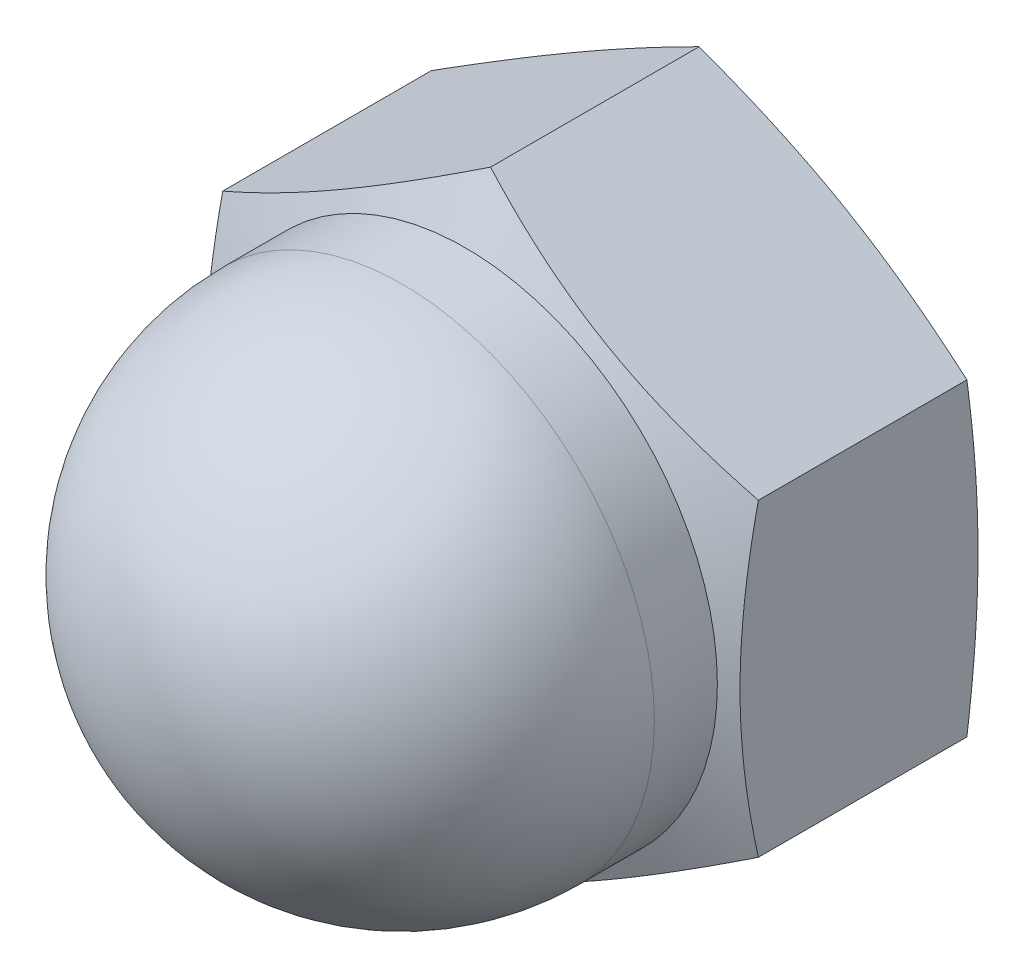
ISO-10303-21;
HEADER;
FILE_DESCRIPTION(('STEP AP214'),'2;1');
FILE_NAME('part.step','',(''),(''),'','','');
FILE_SCHEMA(('AUTOMOTIVE_DESIGN { 1 0 10303 214 1 1 1 1 }'));
ENDSEC;
DATA;
#1=APPLICATION_CONTEXT('core data for automotive mechanical design processes');
#2=APPLICATION_PROTOCOL_DEFINITION('international standard','automotive_design',2000,#1);
#3=PRODUCT_CONTEXT('',#1,'mechanical');
#4=PRODUCT('Part','Part','',(#3));
#5=PRODUCT_RELATED_PRODUCT_CATEGORY('part','',(#4));
#6=PRODUCT_DEFINITION_FORMATION('','',#4);
#7=PRODUCT_DEFINITION_CONTEXT('part definition',#1,'design');
#8=PRODUCT_DEFINITION('design','',#6,#7);
#9=PRODUCT_DEFINITION_SHAPE('','',#8);
#10=(LENGTH_UNIT() NAMED_UNIT(*) SI_UNIT(.MILLI.,.METRE.));
#11=(NAMED_UNIT(*) PLANE_ANGLE_UNIT() SI_UNIT($,.RADIAN.));
#12=(NAMED_UNIT(*) SI_UNIT($,.STERADIAN.) SOLID_ANGLE_UNIT());
#13=UNCERTAINTY_MEASURE_WITH_UNIT(LENGTH_MEASURE(1.E-05),#10,'distance_accuracy_value','');
#14=(GEOMETRIC_REPRESENTATION_CONTEXT(3) GLOBAL_UNCERTAINTY_ASSIGNED_CONTEXT((#13)) GLOBAL_UNIT_ASSIGNED_CONTEXT((#10,
#11,#12)) REPRESENTATION_CONTEXT('',''));
#15=CARTESIAN_POINT('',(0.,0.,0.));
#16=DIRECTION('',(0.,0.,1.));
#17=DIRECTION('',(1.,0.,0.));
#18=AXIS2_PLACEMENT_3D('',#15,#16,#17);
#19=CARTESIAN_POINT('',(4.25,-7.36121593216773,0.));
#20=DIRECTION('',(0.5,-0.866025403784439,0.));
#21=DIRECTION('',(0.866025403784439,0.5,0.));
#22=AXIS2_PLACEMENT_3D('',#19,#20,#21);
#23=PLANE('',#22);
#24=CARTESIAN_POINT('',(0.,-9.81495457622364,7.2));
#25=CARTESIAN_POINT('',(4.25,-7.36121593216771,8.28156476253477));
#26=CARTESIAN_POINT('',(8.5,-4.90747728811183,7.2));
#27=(BOUNDED_CURVE() B_SPLINE_CURVE(2,(#24,#25,#26),.UNSPECIFIED.,.F.,
.F.) B_SPLINE_CURVE_WITH_KNOTS((3,3),(0.,9.88317351972094),
.UNSPECIFIED.) CURVE() GEOMETRIC_REPRESENTATION_ITEM() RATIONAL_B_SPLINE_CURVE((1.,
1.15470053837925,1.)) REPRESENTATION_ITEM(''));
#28=CARTESIAN_POINT('',(0.,-9.81495457622364,7.2));
#29=VERTEX_POINT('',#28);
#30=CARTESIAN_POINT('',(8.5,-4.90747728811183,7.2));
#31=VERTEX_POINT('',#30);
#32=EDGE_CURVE('E100',#29,#31,#27,.T.);
#33=ORIENTED_EDGE('',*,*,#32,.F.);
#34=DIRECTION('',(0.,0.,1.));
#35=VECTOR('',#34,1.);
#36=CARTESIAN_POINT('',(0.,-9.81495457622364,0.));
#37=LINE('',#36,#35);
#38=CARTESIAN_POINT('',(0.,-9.81495457622364,0.580097830349188));
#39=VERTEX_POINT('',#38);
#40=EDGE_CURVE('E85',#39,#29,#37,.T.);
#41=ORIENTED_EDGE('',*,*,#40,.F.);
#42=CARTESIAN_POINT('',(8.5,-4.90747728811183,0.580097830349187));
#43=CARTESIAN_POINT('',(4.25,-7.36121593216773,-0.0773794577626313));
#44=CARTESIAN_POINT('',(0.,-9.81495457622364,0.580097830349188));
#45=(BOUNDED_CURVE() B_SPLINE_CURVE(2,(#42,#43,#44),.UNSPECIFIED.,.F.,
.F.) B_SPLINE_CURVE_WITH_KNOTS((3,3),(0.,9.84021900679874),
.UNSPECIFIED.) CURVE() GEOMETRIC_REPRESENTATION_ITEM() RATIONAL_B_SPLINE_CURVE((1.,
1.15470053837925,1.)) REPRESENTATION_ITEM(''));
#46=CARTESIAN_POINT('',(8.5,-4.90747728811183,0.580097830349188));
#47=VERTEX_POINT('',#46);
#48=EDGE_CURVE('E131',#47,#39,#45,.T.);
#49=ORIENTED_EDGE('',*,*,#48,.F.);
#50=DIRECTION('',(0.,0.,1.));
#51=VECTOR('',#50,1.);
#52=CARTESIAN_POINT('',(8.5,-4.90747728811183,0.));
#53=LINE('',#52,#51);
#54=EDGE_CURVE('E9',#47,#31,#53,.T.);
#55=ORIENTED_EDGE('',*,*,#54,.T.);
#56=EDGE_LOOP('',(#33,#41,#49,#55));
#57=FACE_BOUND('',#56,.T.);
#58=ADVANCED_FACE('F15',(#57),#23,.T.);
#59=CARTESIAN_POINT('',(8.5,0.,0.));
#60=DIRECTION('',(1.,0.,0.));
#61=DIRECTION('',(0.,1.,0.));
#62=AXIS2_PLACEMENT_3D('',#59,#60,#61);
#63=PLANE('',#62);
#64=CARTESIAN_POINT('',(8.5,-4.90747728811182,7.2));
#65=CARTESIAN_POINT('',(8.49999999999999,0.,8.28156476253477));
#66=CARTESIAN_POINT('',(8.5,4.90747728811182,7.2));
#67=(BOUNDED_CURVE() B_SPLINE_CURVE(2,(#64,#65,#66),.UNSPECIFIED.,.F.,
.F.) B_SPLINE_CURVE_WITH_KNOTS((3,3),(0.,9.88317351972096),
.UNSPECIFIED.) CURVE() GEOMETRIC_REPRESENTATION_ITEM() RATIONAL_B_SPLINE_CURVE((1.,
1.15470053837925,1.)) REPRESENTATION_ITEM(''));
#68=CARTESIAN_POINT('',(8.5,4.90747728811182,7.2));
#69=VERTEX_POINT('',#68);
#70=EDGE_CURVE('E105',#31,#69,#67,.T.);
#71=ORIENTED_EDGE('',*,*,#70,.F.);
#72=ORIENTED_EDGE('',*,*,#54,.F.);
#73=CARTESIAN_POINT('',(8.5,4.90747728811182,0.580097830349187));
#74=CARTESIAN_POINT('',(8.50000000000001,0.,-0.077379457762633));
#75=CARTESIAN_POINT('',(8.5,-4.90747728811183,0.580097830349188));
#76=(BOUNDED_CURVE() B_SPLINE_CURVE(2,(#73,#74,#75),.UNSPECIFIED.,.F.,
.F.) B_SPLINE_CURVE_WITH_KNOTS((3,3),(0.,9.84021900679875),
.UNSPECIFIED.) CURVE() GEOMETRIC_REPRESENTATION_ITEM() RATIONAL_B_SPLINE_CURVE((1.,
1.15470053837925,1.)) REPRESENTATION_ITEM(''));
#77=CARTESIAN_POINT('',(8.5,4.90747728811182,0.580097830349187));
#78=VERTEX_POINT('',#77);
#79=EDGE_CURVE('E19',#78,#47,#76,.T.);
#80=ORIENTED_EDGE('',*,*,#79,.F.);
#81=DIRECTION('',(0.,0.,1.));
#82=VECTOR('',#81,1.);
#83=CARTESIAN_POINT('',(8.5,4.90747728811182,0.));
#84=LINE('',#83,#82);
#85=EDGE_CURVE('E27',#78,#69,#84,.T.);
#86=ORIENTED_EDGE('',*,*,#85,.T.);
#87=EDGE_LOOP('',(#71,#72,#80,#86));
#88=FACE_BOUND('',#87,.T.);
#89=ADVANCED_FACE('F229',(#88),#63,.T.);
#90=CARTESIAN_POINT('',(0.,0.,0.));
#91=DIRECTION('',(0.,0.,1.));
#92=DIRECTION('',(1.,0.,0.));
#93=AXIS2_PLACEMENT_3D('',#90,#91,#92);
#94=PLANE('',#93);
#95=CARTESIAN_POINT('',(0.,0.,0.));
#96=DIRECTION('',(0.,0.,1.));
#97=DIRECTION('',(1.,0.,0.));
#98=AXIS2_PLACEMENT_3D('',#95,#96,#97);
#99=CIRCLE('',#98,7.65);
#100=CARTESIAN_POINT('',(7.65,0.,0.));
#101=VERTEX_POINT('',#100);
#102=EDGE_CURVE('E156',#101,#101,#99,.T.);
#103=ORIENTED_EDGE('',*,*,#102,.F.);
#104=EDGE_LOOP('',(#103));
#105=FACE_BOUND('',#104,.T.);
#106=CARTESIAN_POINT('',(0.,0.,0.));
#107=DIRECTION('',(0.,0.,1.));
#108=DIRECTION('',(1.,0.,0.));
#109=AXIS2_PLACEMENT_3D('',#106,#107,#108);
#110=CIRCLE('',#109,5.);
#111=CARTESIAN_POINT('',(5.,0.,0.));
#112=VERTEX_POINT('',#111);
#113=EDGE_CURVE('E126',#112,#112,#110,.T.);
#114=ORIENTED_EDGE('',*,*,#113,.T.);
#115=EDGE_LOOP('',(#114));
#116=FACE_BOUND('',#115,.T.);
#117=ADVANCED_FACE('F233',(#105,#116),#94,.F.);
#118=CARTESIAN_POINT('',(4.25,7.36121593216773,0.));
#119=DIRECTION('',(0.5,0.866025403784439,0.));
#120=DIRECTION('',(-0.866025403784439,0.5,0.));
#121=AXIS2_PLACEMENT_3D('',#118,#119,#120);
#122=PLANE('',#121);
#123=CARTESIAN_POINT('',(8.5,4.90747728811182,7.2));
#124=CARTESIAN_POINT('',(4.25,7.36121593216769,8.28156476253478));
#125=CARTESIAN_POINT('',(0.,9.81495457622363,7.2));
#126=(BOUNDED_CURVE() B_SPLINE_CURVE(2,(#123,#124,#125),.UNSPECIFIED.,.F.,
.F.) B_SPLINE_CURVE_WITH_KNOTS((3,3),(0.,9.88317351972094),
.UNSPECIFIED.) CURVE() GEOMETRIC_REPRESENTATION_ITEM() RATIONAL_B_SPLINE_CURVE((1.,
1.15470053837926,1.)) REPRESENTATION_ITEM(''));
#127=CARTESIAN_POINT('',(0.,9.81495457622364,7.2));
#128=VERTEX_POINT('',#127);
#129=EDGE_CURVE('E149',#69,#128,#126,.T.);
#130=ORIENTED_EDGE('',*,*,#129,.F.);
#131=ORIENTED_EDGE('',*,*,#85,.F.);
#132=CARTESIAN_POINT('',(0.,9.81495457622364,0.580097830349187));
#133=CARTESIAN_POINT('',(4.25,7.36121593216771,-0.0773794577626321));
#134=CARTESIAN_POINT('',(8.5,4.90747728811182,0.580097830349187));
#135=(BOUNDED_CURVE() B_SPLINE_CURVE(2,(#132,#133,#134),.UNSPECIFIED.,.F.,
.F.) B_SPLINE_CURVE_WITH_KNOTS((3,3),(0.,9.84021900679874),
.UNSPECIFIED.) CURVE() GEOMETRIC_REPRESENTATION_ITEM() RATIONAL_B_SPLINE_CURVE((1.,
1.15470053837925,1.)) REPRESENTATION_ITEM(''));
#136=CARTESIAN_POINT('',(0.,9.81495457622364,0.580097830349187));
#137=VERTEX_POINT('',#136);
#138=EDGE_CURVE('E137',#137,#78,#135,.T.);
#139=ORIENTED_EDGE('',*,*,#138,.F.);
#140=DIRECTION('',(0.,0.,1.));
#141=VECTOR('',#140,1.);
#142=CARTESIAN_POINT('',(0.,9.81495457622364,0.));
#143=LINE('',#142,#141);
#144=EDGE_CURVE('E136',#137,#128,#143,.T.);
#145=ORIENTED_EDGE('',*,*,#144,.T.);
#146=EDGE_LOOP('',(#130,#131,#139,#145));
#147=FACE_BOUND('',#146,.T.);
#148=ADVANCED_FACE('F243',(#147),#122,.T.);
#149=CARTESIAN_POINT('',(-4.25,7.36121593216773,0.));
#150=DIRECTION('',(-0.5,0.866025403784439,0.));
#151=DIRECTION('',(-0.866025403784439,-0.5,0.));
#152=AXIS2_PLACEMENT_3D('',#149,#150,#151);
#153=PLANE('',#152);
#154=CARTESIAN_POINT('',(0.,9.81495457622364,7.2));
#155=CARTESIAN_POINT('',(-4.25,7.36121593216774,8.28156476253478));
#156=CARTESIAN_POINT('',(-8.5,4.90747728811182,7.2));
#157=(BOUNDED_CURVE() B_SPLINE_CURVE(2,(#154,#155,#156),.UNSPECIFIED.,.F.,
.F.) B_SPLINE_CURVE_WITH_KNOTS((3,3),(0.,9.88317351972095),
.UNSPECIFIED.) CURVE() GEOMETRIC_REPRESENTATION_ITEM() RATIONAL_B_SPLINE_CURVE((1.,
1.15470053837925,1.)) REPRESENTATION_ITEM(''));
#158=CARTESIAN_POINT('',(-8.5,4.90747728811182,7.2));
#159=VERTEX_POINT('',#158);
#160=EDGE_CURVE('E113',#128,#159,#157,.T.);
#161=ORIENTED_EDGE('',*,*,#160,.F.);
#162=ORIENTED_EDGE('',*,*,#144,.F.);
#163=CARTESIAN_POINT('',(-8.5,4.90747728811182,0.580097830349187));
#164=CARTESIAN_POINT('',(-4.25,7.36121593216771,-0.0773794577626321));
#165=CARTESIAN_POINT('',(0.,9.81495457622364,0.580097830349187));
#166=(BOUNDED_CURVE() B_SPLINE_CURVE(2,(#163,#164,#165),.UNSPECIFIED.,.F.,
.F.) B_SPLINE_CURVE_WITH_KNOTS((3,3),(0.,9.84021900679874),
.UNSPECIFIED.) CURVE() GEOMETRIC_REPRESENTATION_ITEM() RATIONAL_B_SPLINE_CURVE((1.,
1.15470053837925,1.)) REPRESENTATION_ITEM(''));
#167=CARTESIAN_POINT('',(-8.5,4.90747728811182,0.580097830349187));
#168=VERTEX_POINT('',#167);
#169=EDGE_CURVE('E160',#168,#137,#166,.T.);
#170=ORIENTED_EDGE('',*,*,#169,.F.);
#171=DIRECTION('',(0.,0.,1.));
#172=VECTOR('',#171,1.);
#173=CARTESIAN_POINT('',(-8.5,4.90747728811182,0.));
#174=LINE('',#173,#172);
#175=EDGE_CURVE('E96',#168,#159,#174,.T.);
#176=ORIENTED_EDGE('',*,*,#175,.T.);
#177=EDGE_LOOP('',(#161,#162,#170,#176));
#178=FACE_BOUND('',#177,.T.);
#179=ADVANCED_FACE('F240',(#178),#153,.T.);
#180=CARTESIAN_POINT('',(-8.5,0.,0.));
#181=DIRECTION('',(-1.,0.,0.));
#182=DIRECTION('',(0.,-1.,0.));
#183=AXIS2_PLACEMENT_3D('',#180,#181,#182);
#184=PLANE('',#183);
#185=CARTESIAN_POINT('',(-8.5,4.90747728811182,7.2));
#186=CARTESIAN_POINT('',(-8.5,0.,8.28156476253478));
#187=CARTESIAN_POINT('',(-8.5,-4.90747728811182,7.2));
#188=(BOUNDED_CURVE() B_SPLINE_CURVE(2,(#185,#186,#187),.UNSPECIFIED.,.F.,
.F.) B_SPLINE_CURVE_WITH_KNOTS((3,3),(0.,9.88317351972095),
.UNSPECIFIED.) CURVE() GEOMETRIC_REPRESENTATION_ITEM() RATIONAL_B_SPLINE_CURVE((1.,
1.15470053837925,1.)) REPRESENTATION_ITEM(''));
#189=CARTESIAN_POINT('',(-8.5,-4.90747728811182,7.2));
#190=VERTEX_POINT('',#189);
#191=EDGE_CURVE('E111',#159,#190,#188,.T.);
#192=ORIENTED_EDGE('',*,*,#191,.F.);
#193=ORIENTED_EDGE('',*,*,#175,.F.);
#194=CARTESIAN_POINT('',(-8.5,-4.90747728811182,0.580097830349188));
#195=CARTESIAN_POINT('',(-8.5,0.,-0.0773794577626322));
#196=CARTESIAN_POINT('',(-8.5,4.90747728811182,0.580097830349187));
#197=(BOUNDED_CURVE() B_SPLINE_CURVE(2,(#194,#195,#196),.UNSPECIFIED.,.F.,
.F.) B_SPLINE_CURVE_WITH_KNOTS((3,3),(0.,9.84021900679875),
.UNSPECIFIED.) CURVE() GEOMETRIC_REPRESENTATION_ITEM() RATIONAL_B_SPLINE_CURVE((1.,
1.15470053837925,1.)) REPRESENTATION_ITEM(''));
#198=CARTESIAN_POINT('',(-8.5,-4.90747728811182,0.580097830349188));
#199=VERTEX_POINT('',#198);
#200=EDGE_CURVE('E130',#199,#168,#197,.T.);
#201=ORIENTED_EDGE('',*,*,#200,.F.);
#202=DIRECTION('',(0.,0.,1.));
#203=VECTOR('',#202,1.);
#204=CARTESIAN_POINT('',(-8.5,-4.90747728811182,0.));
#205=LINE('',#204,#203);
#206=EDGE_CURVE('E97',#199,#190,#205,.T.);
#207=ORIENTED_EDGE('',*,*,#206,.T.);
#208=EDGE_LOOP('',(#192,#193,#201,#207));
#209=FACE_BOUND('',#208,.T.);
#210=ADVANCED_FACE('F242',(#209),#184,.T.);
#211=CARTESIAN_POINT('',(-4.25,-7.36121593216773,0.));
#212=DIRECTION('',(-0.5,-0.866025403784439,0.));
#213=DIRECTION('',(0.866025403784439,-0.5,0.));
#214=AXIS2_PLACEMENT_3D('',#211,#212,#213);
#215=PLANE('',#214);
#216=CARTESIAN_POINT('',(-8.5,-4.90747728811182,7.2));
#217=CARTESIAN_POINT('',(-4.25,-7.36121593216773,8.28156476253478));
#218=CARTESIAN_POINT('',(0.,-9.81495457622363,7.2));
#219=(BOUNDED_CURVE() B_SPLINE_CURVE(2,(#216,#217,#218),.UNSPECIFIED.,.F.,
.F.) B_SPLINE_CURVE_WITH_KNOTS((3,3),(0.,9.88317351972094),
.UNSPECIFIED.) CURVE() GEOMETRIC_REPRESENTATION_ITEM() RATIONAL_B_SPLINE_CURVE((1.,
1.15470053837925,1.)) REPRESENTATION_ITEM(''));
#220=EDGE_CURVE('E89',#190,#29,#219,.T.);
#221=ORIENTED_EDGE('',*,*,#220,.F.);
#222=ORIENTED_EDGE('',*,*,#206,.F.);
#223=CARTESIAN_POINT('',(0.,-9.81495457622364,0.580097830349188));
#224=CARTESIAN_POINT('',(-4.25,-7.36121593216773,-0.0773794577626328));
#225=CARTESIAN_POINT('',(-8.5,-4.90747728811181,0.580097830349188));
#226=(BOUNDED_CURVE() B_SPLINE_CURVE(2,(#223,#224,#225),.UNSPECIFIED.,.F.,
.F.) B_SPLINE_CURVE_WITH_KNOTS((3,3),(0.,9.84021900679875),
.UNSPECIFIED.) CURVE() GEOMETRIC_REPRESENTATION_ITEM() RATIONAL_B_SPLINE_CURVE((1.,
1.15470053837925,1.)) REPRESENTATION_ITEM(''));
#227=EDGE_CURVE('E92',#39,#199,#226,.T.);
#228=ORIENTED_EDGE('',*,*,#227,.F.);
#229=ORIENTED_EDGE('',*,*,#40,.T.);
#230=EDGE_LOOP('',(#221,#222,#228,#229));
#231=FACE_BOUND('',#230,.T.);
#232=ADVANCED_FACE('F87',(#231),#215,.T.);
#233=CARTESIAN_POINT('',(0.,0.,10.));
#234=DIRECTION('',(0.,-1.,0.));
#235=DIRECTION('',(1.,0.,0.));
#236=AXIS2_PLACEMENT_3D('',#233,#234,#235);
#237=SPHERICAL_SURFACE('',#236,8.);
#238=CARTESIAN_POINT('',(0.,0.,10.));
#239=DIRECTION('',(0.,0.,1.));
#240=DIRECTION('',(1.,0.,0.));
#241=AXIS2_PLACEMENT_3D('',#238,#239,#240);
#242=SPHERICAL_SURFACE('',#241,8.);
#243=CARTESIAN_POINT('',(0.,0.,10.));
#244=DIRECTION('',(0.,0.,1.));
#245=DIRECTION('',(1.,0.,0.));
#246=AXIS2_PLACEMENT_3D('',#243,#244,#245);
#247=CIRCLE('',#246,8.);
#248=CARTESIAN_POINT('',(8.,0.,10.));
#249=VERTEX_POINT('',#248);
#250=EDGE_CURVE('E34',#249,#249,#247,.T.);
#251=ORIENTED_EDGE('',*,*,#250,.T.);
#252=EDGE_LOOP('',(#251));
#253=FACE_BOUND('',#252,.T.);
#254=ADVANCED_FACE('F17',(#253),#242,.T.);
#255=CARTESIAN_POINT('',(0.,0.,9.));
#256=DIRECTION('',(0.,0.,-1.));
#257=DIRECTION('',(1.,0.,0.));
#258=AXIS2_PLACEMENT_3D('',#255,#256,#257);
#259=CYLINDRICAL_SURFACE('',#258,8.);
#260=CARTESIAN_POINT('',(0.,0.,8.));
#261=DIRECTION('',(0.,0.,1.));
#262=DIRECTION('',(1.,0.,0.));
#263=AXIS2_PLACEMENT_3D('',#260,#261,#262);
#264=CIRCLE('',#263,8.);
#265=CARTESIAN_POINT('',(8.,0.,8.));
#266=VERTEX_POINT('',#265);
#267=EDGE_CURVE('E177',#266,#266,#264,.T.);
#268=ORIENTED_EDGE('',*,*,#267,.T.);
#269=EDGE_LOOP('',(#268));
#270=FACE_BOUND('',#269,.T.);
#271=ORIENTED_EDGE('',*,*,#250,.F.);
#272=EDGE_LOOP('',(#271));
#273=FACE_BOUND('',#272,.T.);
#274=ADVANCED_FACE('F236',(#270,#273),#259,.T.);
#275=CARTESIAN_POINT('',(0.,0.,7.6));
#276=DIRECTION('',(0.,0.,-1.));
#277=DIRECTION('',(1.,0.,0.));
#278=AXIS2_PLACEMENT_3D('',#275,#276,#277);
#279=CONICAL_SURFACE('',#278,8.90747728811182,1.155634161013);
#280=ORIENTED_EDGE('',*,*,#267,.F.);
#281=EDGE_LOOP('',(#280));
#282=FACE_BOUND('',#281,.T.);
#283=ORIENTED_EDGE('',*,*,#129,.T.);
#284=ORIENTED_EDGE('',*,*,#160,.T.);
#285=ORIENTED_EDGE('',*,*,#191,.T.);
#286=ORIENTED_EDGE('',*,*,#220,.T.);
#287=ORIENTED_EDGE('',*,*,#32,.T.);
#288=ORIENTED_EDGE('',*,*,#70,.T.);
#289=EDGE_LOOP('',(#283,#284,#285,#286,#287,#288));
#290=FACE_BOUND('',#289,.T.);
#291=ADVANCED_FACE('F108',(#282,#290),#279,.T.);
#292=CARTESIAN_POINT('',(0.,0.,0.290048915174593));
#293=DIRECTION('',(0.,0.,1.));
#294=DIRECTION('',(1.,0.,0.));
#295=AXIS2_PLACEMENT_3D('',#292,#293,#294);
#296=CONICAL_SURFACE('',#295,8.73247728811182,1.30899693899575);
#297=ORIENTED_EDGE('',*,*,#102,.T.);
#298=EDGE_LOOP('',(#297));
#299=FACE_BOUND('',#298,.T.);
#300=ORIENTED_EDGE('',*,*,#138,.T.);
#301=ORIENTED_EDGE('',*,*,#79,.T.);
#302=ORIENTED_EDGE('',*,*,#48,.T.);
#303=ORIENTED_EDGE('',*,*,#227,.T.);
#304=ORIENTED_EDGE('',*,*,#200,.T.);
#305=ORIENTED_EDGE('',*,*,#169,.T.);
#306=EDGE_LOOP('',(#300,#301,#302,#303,#304,#305));
#307=FACE_BOUND('',#306,.T.);
#308=ADVANCED_FACE('F214',(#299,#307),#296,.T.);
#309=CARTESIAN_POINT('',(0.,0.,13.8980689022248));
#310=DIRECTION('',(0.,0.,-1.));
#311=DIRECTION('',(1.,0.,0.));
#312=AXIS2_PLACEMENT_3D('',#309,#310,#311);
#313=CONICAL_SURFACE('',#312,2.16171875,1.0471975511966);
#314=CARTESIAN_POINT('',(0.,0.,12.65));
#315=DIRECTION('',(0.,0.,1.));
#316=DIRECTION('',(1.,0.,0.));
#317=AXIS2_PLACEMENT_3D('',#314,#315,#316);
#318=CIRCLE('',#317,4.3234375);
#319=CARTESIAN_POINT('',(4.3234375,0.,12.65));
#320=VERTEX_POINT('',#319);
#321=EDGE_CURVE('E119',#320,#320,#318,.T.);
#322=ORIENTED_EDGE('',*,*,#321,.F.);
#323=EDGE_LOOP('',(#322));
#324=FACE_BOUND('',#323,.T.);
#325=CARTESIAN_POINT('',(0.,0.,15.1461378044495));
#326=VERTEX_POINT('',#325);
#327=VERTEX_LOOP('',#326);
#328=FACE_BOUND('',#327,.T.);
#329=ADVANCED_FACE('F211',(#324,#328),#313,.F.);
#330=CARTESIAN_POINT('',(0.,0.,6.5203067707493));
#331=DIRECTION('',(0.,0.,-1.));
#332=DIRECTION('',(1.,0.,0.));
#333=AXIS2_PLACEMENT_3D('',#330,#331,#332);
#334=CYLINDRICAL_SURFACE('',#333,4.3234375);
#335=CARTESIAN_POINT('',(0.,0.,0.390613541498606));
#336=DIRECTION('',(0.,0.,1.));
#337=DIRECTION('',(1.,0.,0.));
#338=AXIS2_PLACEMENT_3D('',#335,#336,#337);
#339=CIRCLE('',#338,4.3234375);
#340=CARTESIAN_POINT('',(4.3234375,0.,0.390613541498606));
#341=VERTEX_POINT('',#340);
#342=EDGE_CURVE('E121',#341,#341,#339,.T.);
#343=ORIENTED_EDGE('',*,*,#342,.F.);
#344=EDGE_LOOP('',(#343));
#345=FACE_BOUND('',#344,.T.);
#346=ORIENTED_EDGE('',*,*,#321,.T.);
#347=EDGE_LOOP('',(#346));
#348=FACE_BOUND('',#347,.T.);
#349=ADVANCED_FACE('F209',(#345,#348),#334,.F.);
#350=CARTESIAN_POINT('',(0.,0.,0.195306770749303));
#351=DIRECTION('',(0.,0.,-1.));
#352=DIRECTION('',(1.,0.,0.));
#353=AXIS2_PLACEMENT_3D('',#350,#351,#352);
#354=CONICAL_SURFACE('',#353,4.66171875,1.0471975511966);
#355=ORIENTED_EDGE('',*,*,#113,.F.);
#356=EDGE_LOOP('',(#355));
#357=FACE_BOUND('',#356,.T.);
#358=ORIENTED_EDGE('',*,*,#342,.T.);
#359=EDGE_LOOP('',(#358));
#360=FACE_BOUND('',#359,.T.);
#361=ADVANCED_FACE('F221',(#357,#360),#354,.F.);
#362=CLOSED_SHELL('',(#58,#89,#117,#148,#179,#210,#232,#254,#274,#291,#308,#329,#349,#361));
#363=MANIFOLD_SOLID_BREP('B1',#362);
#364=ADVANCED_BREP_SHAPE_REPRESENTATION('',(#18,#363),#14);
#365=SHAPE_DEFINITION_REPRESENTATION(#9,#364);
ENDSEC;
END-ISO-10303-21;
